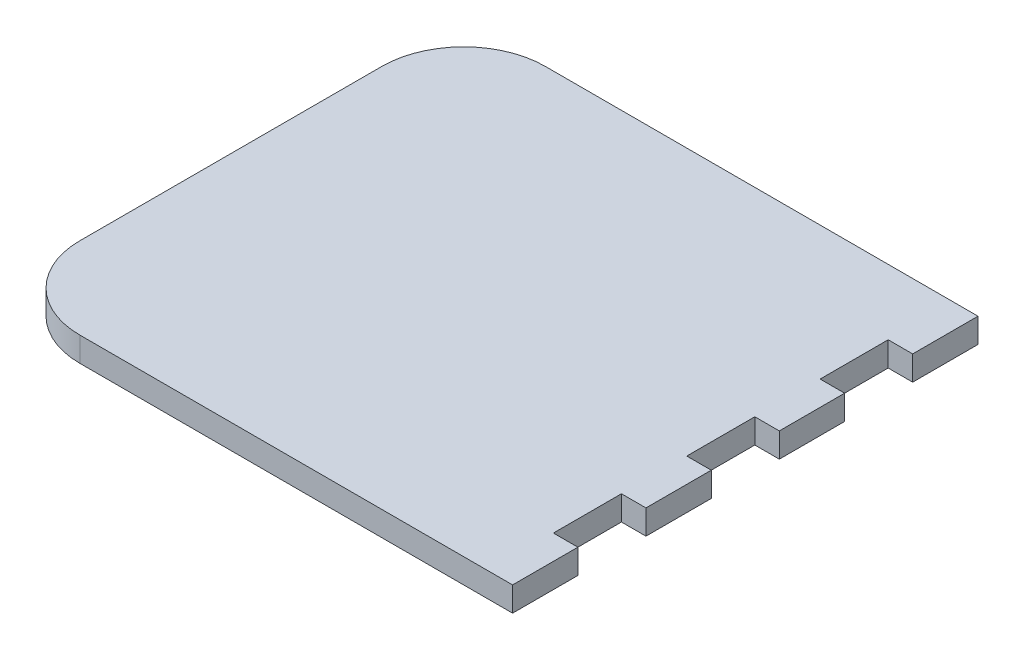
ISO-10303-21;
HEADER;
FILE_DESCRIPTION(('STEP AP214'),'2;1');
FILE_NAME('part.step','',(''),(''),'','','');
FILE_SCHEMA(('AUTOMOTIVE_DESIGN { 1 0 10303 214 1 1 1 1 }'));
ENDSEC;
DATA;
#1=APPLICATION_CONTEXT('core data for automotive mechanical design processes');
#2=APPLICATION_PROTOCOL_DEFINITION('international standard','automotive_design',2000,#1);
#3=PRODUCT_CONTEXT('',#1,'mechanical');
#4=PRODUCT('Part','Part','',(#3));
#5=PRODUCT_RELATED_PRODUCT_CATEGORY('part','',(#4));
#6=PRODUCT_DEFINITION_FORMATION('','',#4);
#7=PRODUCT_DEFINITION_CONTEXT('part definition',#1,'design');
#8=PRODUCT_DEFINITION('design','',#6,#7);
#9=PRODUCT_DEFINITION_SHAPE('','',#8);
#10=(LENGTH_UNIT() NAMED_UNIT(*) SI_UNIT(.MILLI.,.METRE.));
#11=(NAMED_UNIT(*) PLANE_ANGLE_UNIT() SI_UNIT($,.RADIAN.));
#12=(NAMED_UNIT(*) SI_UNIT($,.STERADIAN.) SOLID_ANGLE_UNIT());
#13=UNCERTAINTY_MEASURE_WITH_UNIT(LENGTH_MEASURE(1.E-05),#10,'distance_accuracy_value','');
#14=(GEOMETRIC_REPRESENTATION_CONTEXT(3) GLOBAL_UNCERTAINTY_ASSIGNED_CONTEXT((#13)) GLOBAL_UNIT_ASSIGNED_CONTEXT((#10,
#11,#12)) REPRESENTATION_CONTEXT('',''));
#15=CARTESIAN_POINT('',(0.,0.,0.));
#16=DIRECTION('',(0.,0.,1.));
#17=DIRECTION('',(1.,0.,0.));
#18=AXIS2_PLACEMENT_3D('',#15,#16,#17);
#19=CARTESIAN_POINT('',(0.,3.,0.));
#20=DIRECTION('',(-1.,0.,0.));
#21=DIRECTION('',(0.,0.,1.));
#22=AXIS2_PLACEMENT_3D('',#19,#20,#21);
#23=PLANE('',#22);
#24=DIRECTION('',(0.,1.,0.));
#25=VECTOR('',#24,1.);
#26=CARTESIAN_POINT('',(0.,0.,-40.6666666666667));
#27=LINE('',#26,#25);
#28=CARTESIAN_POINT('',(0.,0.,-40.6666666666667));
#29=VERTEX_POINT('',#28);
#30=CARTESIAN_POINT('',(0.,3.,-40.6666666666667));
#31=VERTEX_POINT('',#30);
#32=EDGE_CURVE('E169',#29,#31,#27,.T.);
#33=ORIENTED_EDGE('',*,*,#32,.T.);
#34=DIRECTION('',(0.,0.,-1.));
#35=VECTOR('',#34,1.);
#36=CARTESIAN_POINT('',(0.,3.,0.));
#37=LINE('',#36,#35);
#38=CARTESIAN_POINT('',(0.,3.,-32.6666666666667));
#39=VERTEX_POINT('',#38);
#40=EDGE_CURVE('E338',#39,#31,#37,.T.);
#41=ORIENTED_EDGE('',*,*,#40,.F.);
#42=DIRECTION('',(0.,1.,0.));
#43=VECTOR('',#42,1.);
#44=CARTESIAN_POINT('',(0.,0.,-32.6666666666667));
#45=LINE('',#44,#43);
#46=CARTESIAN_POINT('',(0.,0.,-32.6666666666667));
#47=VERTEX_POINT('',#46);
#48=EDGE_CURVE('E222',#47,#39,#45,.T.);
#49=ORIENTED_EDGE('',*,*,#48,.F.);
#50=DIRECTION('',(0.,0.,-1.));
#51=VECTOR('',#50,1.);
#52=CARTESIAN_POINT('',(0.,0.,0.));
#53=LINE('',#52,#51);
#54=EDGE_CURVE('E316',#47,#29,#53,.T.);
#55=ORIENTED_EDGE('',*,*,#54,.T.);
#56=EDGE_LOOP('',(#33,#41,#49,#55));
#57=FACE_BOUND('',#56,.T.);
#58=ADVANCED_FACE('F37',(#57),#23,.F.);
#59=DIRECTION('',(0.,1.,0.));
#60=VECTOR('',#59,1.);
#61=CARTESIAN_POINT('',(0.,0.,-24.3333333333333));
#62=LINE('',#61,#60);
#63=CARTESIAN_POINT('',(0.,0.,-24.3333333333333));
#64=VERTEX_POINT('',#63);
#65=CARTESIAN_POINT('',(0.,3.,-24.3333333333333));
#66=VERTEX_POINT('',#65);
#67=EDGE_CURVE('E224',#64,#66,#62,.T.);
#68=ORIENTED_EDGE('',*,*,#67,.T.);
#69=CARTESIAN_POINT('',(0.,3.,-16.3333333333333));
#70=VERTEX_POINT('',#69);
#71=EDGE_CURVE('E257',#70,#66,#37,.T.);
#72=ORIENTED_EDGE('',*,*,#71,.F.);
#73=DIRECTION('',(0.,1.,0.));
#74=VECTOR('',#73,1.);
#75=CARTESIAN_POINT('',(0.,0.,-16.3333333333333));
#76=LINE('',#75,#74);
#77=CARTESIAN_POINT('',(0.,0.,-16.3333333333333));
#78=VERTEX_POINT('',#77);
#79=EDGE_CURVE('E247',#78,#70,#76,.T.);
#80=ORIENTED_EDGE('',*,*,#79,.F.);
#81=EDGE_CURVE('E269',#78,#64,#53,.T.);
#82=ORIENTED_EDGE('',*,*,#81,.T.);
#83=EDGE_LOOP('',(#68,#72,#80,#82));
#84=FACE_BOUND('',#83,.T.);
#85=ADVANCED_FACE('F323',(#84),#23,.F.);
#86=DIRECTION('',(0.,1.,0.));
#87=VECTOR('',#86,1.);
#88=CARTESIAN_POINT('',(0.,0.,-8.));
#89=LINE('',#88,#87);
#90=CARTESIAN_POINT('',(0.,0.,-8.));
#91=VERTEX_POINT('',#90);
#92=CARTESIAN_POINT('',(0.,3.,-8.));
#93=VERTEX_POINT('',#92);
#94=EDGE_CURVE('E249',#91,#93,#89,.T.);
#95=ORIENTED_EDGE('',*,*,#94,.T.);
#96=CARTESIAN_POINT('',(0.,3.,0.));
#97=VERTEX_POINT('',#96);
#98=EDGE_CURVE('E253',#97,#93,#37,.T.);
#99=ORIENTED_EDGE('',*,*,#98,.F.);
#100=DIRECTION('',(0.,-1.,0.));
#101=VECTOR('',#100,1.);
#102=CARTESIAN_POINT('',(0.,3.,0.));
#103=LINE('',#102,#101);
#104=CARTESIAN_POINT('',(0.,0.,0.));
#105=VERTEX_POINT('',#104);
#106=EDGE_CURVE('E264',#97,#105,#103,.T.);
#107=ORIENTED_EDGE('',*,*,#106,.T.);
#108=EDGE_CURVE('E265',#105,#91,#53,.T.);
#109=ORIENTED_EDGE('',*,*,#108,.T.);
#110=EDGE_LOOP('',(#95,#99,#107,#109));
#111=FACE_BOUND('',#110,.T.);
#112=ADVANCED_FACE('F357',(#111),#23,.F.);
#113=CARTESIAN_POINT('',(0.,3.,-49.));
#114=VERTEX_POINT('',#113);
#115=CARTESIAN_POINT('',(0.,3.,-57.));
#116=VERTEX_POINT('',#115);
#117=EDGE_CURVE('E258',#114,#116,#37,.T.);
#118=ORIENTED_EDGE('',*,*,#117,.F.);
#119=DIRECTION('',(0.,1.,0.));
#120=VECTOR('',#119,1.);
#121=CARTESIAN_POINT('',(0.,0.,-49.));
#122=LINE('',#121,#120);
#123=CARTESIAN_POINT('',(0.,0.,-49.));
#124=VERTEX_POINT('',#123);
#125=EDGE_CURVE('E200',#124,#114,#122,.T.);
#126=ORIENTED_EDGE('',*,*,#125,.F.);
#127=CARTESIAN_POINT('',(0.,0.,-57.));
#128=VERTEX_POINT('',#127);
#129=EDGE_CURVE('E246',#124,#128,#53,.T.);
#130=ORIENTED_EDGE('',*,*,#129,.T.);
#131=DIRECTION('',(0.,-1.,0.));
#132=VECTOR('',#131,1.);
#133=CARTESIAN_POINT('',(0.,3.,-57.));
#134=LINE('',#133,#132);
#135=EDGE_CURVE('E277',#116,#128,#134,.T.);
#136=ORIENTED_EDGE('',*,*,#135,.F.);
#137=EDGE_LOOP('',(#118,#126,#130,#136));
#138=FACE_BOUND('',#137,.T.);
#139=ADVANCED_FACE('F314',(#138),#23,.F.);
#140=CARTESIAN_POINT('',(0.,3.,-57.));
#141=DIRECTION('',(0.,0.,1.));
#142=DIRECTION('',(1.,0.,0.));
#143=AXIS2_PLACEMENT_3D('',#140,#141,#142);
#144=PLANE('',#143);
#145=DIRECTION('',(-1.,0.,0.));
#146=VECTOR('',#145,1.);
#147=CARTESIAN_POINT('',(0.,0.,-57.));
#148=LINE('',#147,#146);
#149=CARTESIAN_POINT('',(-53.,0.,-57.));
#150=VERTEX_POINT('',#149);
#151=EDGE_CURVE('E268',#128,#150,#148,.T.);
#152=ORIENTED_EDGE('',*,*,#151,.T.);
#153=DIRECTION('',(0.,-1.,0.));
#154=VECTOR('',#153,1.);
#155=CARTESIAN_POINT('',(-53.,3.,-57.));
#156=LINE('',#155,#154);
#157=CARTESIAN_POINT('',(-53.,3.,-57.));
#158=VERTEX_POINT('',#157);
#159=EDGE_CURVE('E11',#150,#158,#156,.F.);
#160=ORIENTED_EDGE('',*,*,#159,.T.);
#161=DIRECTION('',(-1.,0.,0.));
#162=VECTOR('',#161,1.);
#163=CARTESIAN_POINT('',(0.,3.,-57.));
#164=LINE('',#163,#162);
#165=EDGE_CURVE('E256',#116,#158,#164,.T.);
#166=ORIENTED_EDGE('',*,*,#165,.F.);
#167=ORIENTED_EDGE('',*,*,#135,.T.);
#168=EDGE_LOOP('',(#152,#160,#166,#167));
#169=FACE_BOUND('',#168,.T.);
#170=ADVANCED_FACE('F310',(#169),#144,.F.);
#171=CARTESIAN_POINT('',(-63.,3.,0.));
#172=DIRECTION('',(1.,0.,0.));
#173=DIRECTION('',(0.,0.,-1.));
#174=AXIS2_PLACEMENT_3D('',#171,#172,#173);
#175=PLANE('',#174);
#176=DIRECTION('',(0.,0.,1.));
#177=VECTOR('',#176,1.);
#178=CARTESIAN_POINT('',(-63.,0.,0.));
#179=LINE('',#178,#177);
#180=CARTESIAN_POINT('',(-63.,0.,-47.));
#181=VERTEX_POINT('',#180);
#182=CARTESIAN_POINT('',(-63.,0.,-9.99999999999999));
#183=VERTEX_POINT('',#182);
#184=EDGE_CURVE('E271',#181,#183,#179,.T.);
#185=ORIENTED_EDGE('',*,*,#184,.T.);
#186=DIRECTION('',(0.,-1.,0.));
#187=VECTOR('',#186,1.);
#188=CARTESIAN_POINT('',(-63.,3.,-9.99999999999999));
#189=LINE('',#188,#187);
#190=CARTESIAN_POINT('',(-63.,3.,-9.99999999999999));
#191=VERTEX_POINT('',#190);
#192=EDGE_CURVE('E58',#183,#191,#189,.F.);
#193=ORIENTED_EDGE('',*,*,#192,.T.);
#194=DIRECTION('',(0.,0.,1.));
#195=VECTOR('',#194,1.);
#196=CARTESIAN_POINT('',(-63.,3.,0.));
#197=LINE('',#196,#195);
#198=CARTESIAN_POINT('',(-63.,3.,-47.));
#199=VERTEX_POINT('',#198);
#200=EDGE_CURVE('E260',#199,#191,#197,.T.);
#201=ORIENTED_EDGE('',*,*,#200,.F.);
#202=DIRECTION('',(0.,-1.,0.));
#203=VECTOR('',#202,1.);
#204=CARTESIAN_POINT('',(-63.,3.,-47.));
#205=LINE('',#204,#203);
#206=EDGE_CURVE('E287',#199,#181,#205,.T.);
#207=ORIENTED_EDGE('',*,*,#206,.T.);
#208=EDGE_LOOP('',(#185,#193,#201,#207));
#209=FACE_BOUND('',#208,.T.);
#210=ADVANCED_FACE('F305',(#209),#175,.F.);
#211=CARTESIAN_POINT('',(0.,3.,0.));
#212=DIRECTION('',(0.,0.,-1.));
#213=DIRECTION('',(-1.,0.,0.));
#214=AXIS2_PLACEMENT_3D('',#211,#212,#213);
#215=PLANE('',#214);
#216=DIRECTION('',(1.,0.,0.));
#217=VECTOR('',#216,1.);
#218=CARTESIAN_POINT('',(0.,3.,0.));
#219=LINE('',#218,#217);
#220=CARTESIAN_POINT('',(-53.,3.,0.));
#221=VERTEX_POINT('',#220);
#222=EDGE_CURVE('E262',#221,#97,#219,.T.);
#223=ORIENTED_EDGE('',*,*,#222,.F.);
#224=DIRECTION('',(0.,-1.,0.));
#225=VECTOR('',#224,1.);
#226=CARTESIAN_POINT('',(-53.,3.,0.));
#227=LINE('',#226,#225);
#228=CARTESIAN_POINT('',(-53.,0.,0.));
#229=VERTEX_POINT('',#228);
#230=EDGE_CURVE('E280',#221,#229,#227,.T.);
#231=ORIENTED_EDGE('',*,*,#230,.T.);
#232=DIRECTION('',(1.,0.,0.));
#233=VECTOR('',#232,1.);
#234=CARTESIAN_POINT('',(0.,0.,0.));
#235=LINE('',#234,#233);
#236=EDGE_CURVE('E273',#229,#105,#235,.T.);
#237=ORIENTED_EDGE('',*,*,#236,.T.);
#238=ORIENTED_EDGE('',*,*,#106,.F.);
#239=EDGE_LOOP('',(#223,#231,#237,#238));
#240=FACE_BOUND('',#239,.T.);
#241=ADVANCED_FACE('F300',(#240),#215,.F.);
#242=CARTESIAN_POINT('',(0.,3.,0.));
#243=DIRECTION('',(0.,1.,0.));
#244=DIRECTION('',(0.,0.,1.));
#245=AXIS2_PLACEMENT_3D('',#242,#243,#244);
#246=PLANE('',#245);
#247=ORIENTED_EDGE('',*,*,#200,.T.);
#248=CARTESIAN_POINT('',(-53.,3.,-9.99999999999999));
#249=DIRECTION('',(0.,1.,0.));
#250=DIRECTION('',(0.,0.,1.));
#251=AXIS2_PLACEMENT_3D('',#248,#249,#250);
#252=CIRCLE('',#251,10.);
#253=EDGE_CURVE('E45',#191,#221,#252,.T.);
#254=ORIENTED_EDGE('',*,*,#253,.T.);
#255=ORIENTED_EDGE('',*,*,#222,.T.);
#256=ORIENTED_EDGE('',*,*,#98,.T.);
#257=DIRECTION('',(-1.,0.,0.));
#258=VECTOR('',#257,1.);
#259=CARTESIAN_POINT('',(0.,3.,-8.));
#260=LINE('',#259,#258);
#261=CARTESIAN_POINT('',(-3.,3.,-8.));
#262=VERTEX_POINT('',#261);
#263=EDGE_CURVE('E239',#93,#262,#260,.T.);
#264=ORIENTED_EDGE('',*,*,#263,.T.);
#265=DIRECTION('',(0.,0.,-1.));
#266=VECTOR('',#265,1.);
#267=CARTESIAN_POINT('',(-3.,3.,0.));
#268=LINE('',#267,#266);
#269=CARTESIAN_POINT('',(-3.,3.,-16.3333333333333));
#270=VERTEX_POINT('',#269);
#271=EDGE_CURVE('E221',#262,#270,#268,.T.);
#272=ORIENTED_EDGE('',*,*,#271,.T.);
#273=DIRECTION('',(-1.,0.,0.));
#274=VECTOR('',#273,1.);
#275=CARTESIAN_POINT('',(0.,3.,-16.3333333333333));
#276=LINE('',#275,#274);
#277=EDGE_CURVE('E231',#70,#270,#276,.T.);
#278=ORIENTED_EDGE('',*,*,#277,.F.);
#279=ORIENTED_EDGE('',*,*,#71,.T.);
#280=DIRECTION('',(-1.,0.,0.));
#281=VECTOR('',#280,1.);
#282=CARTESIAN_POINT('',(0.,3.,-24.3333333333333));
#283=LINE('',#282,#281);
#284=CARTESIAN_POINT('',(-3.,3.,-24.3333333333333));
#285=VERTEX_POINT('',#284);
#286=EDGE_CURVE('E214',#66,#285,#283,.T.);
#287=ORIENTED_EDGE('',*,*,#286,.T.);
#288=DIRECTION('',(0.,0.,-1.));
#289=VECTOR('',#288,1.);
#290=CARTESIAN_POINT('',(-3.,3.,0.));
#291=LINE('',#290,#289);
#292=CARTESIAN_POINT('',(-3.,3.,-32.6666666666667));
#293=VERTEX_POINT('',#292);
#294=EDGE_CURVE('E199',#285,#293,#291,.T.);
#295=ORIENTED_EDGE('',*,*,#294,.T.);
#296=DIRECTION('',(-1.,0.,0.));
#297=VECTOR('',#296,1.);
#298=CARTESIAN_POINT('',(0.,3.,-32.6666666666667));
#299=LINE('',#298,#297);
#300=EDGE_CURVE('E206',#39,#293,#299,.T.);
#301=ORIENTED_EDGE('',*,*,#300,.F.);
#302=ORIENTED_EDGE('',*,*,#40,.T.);
#303=DIRECTION('',(-1.,0.,0.));
#304=VECTOR('',#303,1.);
#305=CARTESIAN_POINT('',(0.,3.,-40.6666666666667));
#306=LINE('',#305,#304);
#307=CARTESIAN_POINT('',(-3.,3.,-40.6666666666667));
#308=VERTEX_POINT('',#307);
#309=EDGE_CURVE('E191',#31,#308,#306,.T.);
#310=ORIENTED_EDGE('',*,*,#309,.T.);
#311=DIRECTION('',(0.,0.,-1.));
#312=VECTOR('',#311,1.);
#313=CARTESIAN_POINT('',(-3.,3.,0.));
#314=LINE('',#313,#312);
#315=CARTESIAN_POINT('',(-3.,3.,-49.));
#316=VERTEX_POINT('',#315);
#317=EDGE_CURVE('E181',#308,#316,#314,.T.);
#318=ORIENTED_EDGE('',*,*,#317,.T.);
#319=DIRECTION('',(-1.,0.,0.));
#320=VECTOR('',#319,1.);
#321=CARTESIAN_POINT('',(0.,3.,-49.));
#322=LINE('',#321,#320);
#323=EDGE_CURVE('E188',#114,#316,#322,.T.);
#324=ORIENTED_EDGE('',*,*,#323,.F.);
#325=ORIENTED_EDGE('',*,*,#117,.T.);
#326=ORIENTED_EDGE('',*,*,#165,.T.);
#327=CARTESIAN_POINT('',(-53.,3.,-47.));
#328=DIRECTION('',(0.,1.,0.));
#329=DIRECTION('',(0.,0.,1.));
#330=AXIS2_PLACEMENT_3D('',#327,#328,#329);
#331=CIRCLE('',#330,10.);
#332=EDGE_CURVE('E291',#158,#199,#331,.T.);
#333=ORIENTED_EDGE('',*,*,#332,.T.);
#334=EDGE_LOOP('',(#247,#254,#255,#256,#264,#272,#278,#279,#287,#295,#301,#302,#310,#318,#324,
#325,#326,#333));
#335=FACE_BOUND('',#334,.T.);
#336=ADVANCED_FACE('F295',(#335),#246,.T.);
#337=CARTESIAN_POINT('',(0.,0.,0.));
#338=DIRECTION('',(0.,1.,0.));
#339=DIRECTION('',(0.,0.,1.));
#340=AXIS2_PLACEMENT_3D('',#337,#338,#339);
#341=PLANE('',#340);
#342=ORIENTED_EDGE('',*,*,#236,.F.);
#343=CARTESIAN_POINT('',(-53.,0.,-9.99999999999999));
#344=DIRECTION('',(0.,1.,0.));
#345=DIRECTION('',(0.,0.,1.));
#346=AXIS2_PLACEMENT_3D('',#343,#344,#345);
#347=CIRCLE('',#346,10.);
#348=EDGE_CURVE('E285',#229,#183,#347,.F.);
#349=ORIENTED_EDGE('',*,*,#348,.T.);
#350=ORIENTED_EDGE('',*,*,#184,.F.);
#351=CARTESIAN_POINT('',(-53.,0.,-47.));
#352=DIRECTION('',(0.,1.,0.));
#353=DIRECTION('',(0.,0.,1.));
#354=AXIS2_PLACEMENT_3D('',#351,#352,#353);
#355=CIRCLE('',#354,10.);
#356=EDGE_CURVE('E283',#181,#150,#355,.F.);
#357=ORIENTED_EDGE('',*,*,#356,.T.);
#358=ORIENTED_EDGE('',*,*,#151,.F.);
#359=ORIENTED_EDGE('',*,*,#129,.F.);
#360=DIRECTION('',(-1.,0.,0.));
#361=VECTOR('',#360,1.);
#362=CARTESIAN_POINT('',(0.,0.,-49.));
#363=LINE('',#362,#361);
#364=CARTESIAN_POINT('',(-3.,0.,-49.));
#365=VERTEX_POINT('',#364);
#366=EDGE_CURVE('E174',#124,#365,#363,.T.);
#367=ORIENTED_EDGE('',*,*,#366,.T.);
#368=DIRECTION('',(0.,0.,-1.));
#369=VECTOR('',#368,1.);
#370=CARTESIAN_POINT('',(-3.,0.,0.));
#371=LINE('',#370,#369);
#372=CARTESIAN_POINT('',(-3.,0.,-40.6666666666667));
#373=VERTEX_POINT('',#372);
#374=EDGE_CURVE('E175',#373,#365,#371,.T.);
#375=ORIENTED_EDGE('',*,*,#374,.F.);
#376=DIRECTION('',(-1.,0.,0.));
#377=VECTOR('',#376,1.);
#378=CARTESIAN_POINT('',(0.,0.,-40.6666666666667));
#379=LINE('',#378,#377);
#380=EDGE_CURVE('E163',#29,#373,#379,.T.);
#381=ORIENTED_EDGE('',*,*,#380,.F.);
#382=ORIENTED_EDGE('',*,*,#54,.F.);
#383=DIRECTION('',(-1.,0.,0.));
#384=VECTOR('',#383,1.);
#385=CARTESIAN_POINT('',(0.,0.,-32.6666666666667));
#386=LINE('',#385,#384);
#387=CARTESIAN_POINT('',(-3.,0.,-32.6666666666667));
#388=VERTEX_POINT('',#387);
#389=EDGE_CURVE('E208',#47,#388,#386,.T.);
#390=ORIENTED_EDGE('',*,*,#389,.T.);
#391=DIRECTION('',(0.,0.,-1.));
#392=VECTOR('',#391,1.);
#393=CARTESIAN_POINT('',(-3.,0.,0.));
#394=LINE('',#393,#392);
#395=CARTESIAN_POINT('',(-3.,0.,-24.3333333333333));
#396=VERTEX_POINT('',#395);
#397=EDGE_CURVE('E203',#396,#388,#394,.T.);
#398=ORIENTED_EDGE('',*,*,#397,.F.);
#399=DIRECTION('',(-1.,0.,0.));
#400=VECTOR('',#399,1.);
#401=CARTESIAN_POINT('',(0.,0.,-24.3333333333333));
#402=LINE('',#401,#400);
#403=EDGE_CURVE('E205',#64,#396,#402,.T.);
#404=ORIENTED_EDGE('',*,*,#403,.F.);
#405=ORIENTED_EDGE('',*,*,#81,.F.);
#406=DIRECTION('',(-1.,0.,0.));
#407=VECTOR('',#406,1.);
#408=CARTESIAN_POINT('',(0.,0.,-16.3333333333333));
#409=LINE('',#408,#407);
#410=CARTESIAN_POINT('',(-3.,0.,-16.3333333333333));
#411=VERTEX_POINT('',#410);
#412=EDGE_CURVE('E233',#78,#411,#409,.T.);
#413=ORIENTED_EDGE('',*,*,#412,.T.);
#414=DIRECTION('',(0.,0.,-1.));
#415=VECTOR('',#414,1.);
#416=CARTESIAN_POINT('',(-3.,0.,0.));
#417=LINE('',#416,#415);
#418=CARTESIAN_POINT('',(-3.,0.,-8.));
#419=VERTEX_POINT('',#418);
#420=EDGE_CURVE('E228',#419,#411,#417,.T.);
#421=ORIENTED_EDGE('',*,*,#420,.F.);
#422=DIRECTION('',(-1.,0.,0.));
#423=VECTOR('',#422,1.);
#424=CARTESIAN_POINT('',(0.,0.,-8.));
#425=LINE('',#424,#423);
#426=EDGE_CURVE('E230',#91,#419,#425,.T.);
#427=ORIENTED_EDGE('',*,*,#426,.F.);
#428=ORIENTED_EDGE('',*,*,#108,.F.);
#429=EDGE_LOOP('',(#342,#349,#350,#357,#358,#359,#367,#375,#381,#382,#390,#398,#404,#405,#413,
#421,#427,#428));
#430=FACE_BOUND('',#429,.T.);
#431=ADVANCED_FACE('F186',(#430),#341,.F.);
#432=CARTESIAN_POINT('',(-3.,0.,0.));
#433=DIRECTION('',(1.,0.,0.));
#434=DIRECTION('',(0.,0.,-1.));
#435=AXIS2_PLACEMENT_3D('',#432,#433,#434);
#436=PLANE('',#435);
#437=ORIENTED_EDGE('',*,*,#271,.F.);
#438=DIRECTION('',(0.,1.,0.));
#439=VECTOR('',#438,1.);
#440=CARTESIAN_POINT('',(-3.,0.,-8.));
#441=LINE('',#440,#439);
#442=EDGE_CURVE('E236',#419,#262,#441,.T.);
#443=ORIENTED_EDGE('',*,*,#442,.F.);
#444=ORIENTED_EDGE('',*,*,#420,.T.);
#445=DIRECTION('',(0.,1.,0.));
#446=VECTOR('',#445,1.);
#447=CARTESIAN_POINT('',(-3.,0.,-16.3333333333333));
#448=LINE('',#447,#446);
#449=EDGE_CURVE('E244',#411,#270,#448,.T.);
#450=ORIENTED_EDGE('',*,*,#449,.T.);
#451=EDGE_LOOP('',(#437,#443,#444,#450));
#452=FACE_BOUND('',#451,.T.);
#453=ADVANCED_FACE('F373',(#452),#436,.T.);
#454=CARTESIAN_POINT('',(0.,0.,-16.3333333333333));
#455=DIRECTION('',(0.,0.,-1.));
#456=DIRECTION('',(-1.,0.,0.));
#457=AXIS2_PLACEMENT_3D('',#454,#455,#456);
#458=PLANE('',#457);
#459=ORIENTED_EDGE('',*,*,#277,.T.);
#460=ORIENTED_EDGE('',*,*,#449,.F.);
#461=ORIENTED_EDGE('',*,*,#412,.F.);
#462=ORIENTED_EDGE('',*,*,#79,.T.);
#463=EDGE_LOOP('',(#459,#460,#461,#462));
#464=FACE_BOUND('',#463,.T.);
#465=ADVANCED_FACE('F376',(#464),#458,.F.);
#466=CARTESIAN_POINT('',(0.,0.,-8.));
#467=DIRECTION('',(0.,0.,-1.));
#468=DIRECTION('',(-1.,0.,0.));
#469=AXIS2_PLACEMENT_3D('',#466,#467,#468);
#470=PLANE('',#469);
#471=ORIENTED_EDGE('',*,*,#263,.F.);
#472=ORIENTED_EDGE('',*,*,#94,.F.);
#473=ORIENTED_EDGE('',*,*,#426,.T.);
#474=ORIENTED_EDGE('',*,*,#442,.T.);
#475=EDGE_LOOP('',(#471,#472,#473,#474));
#476=FACE_BOUND('',#475,.T.);
#477=ADVANCED_FACE('F370',(#476),#470,.T.);
#478=CARTESIAN_POINT('',(-3.,0.,0.));
#479=DIRECTION('',(1.,0.,0.));
#480=DIRECTION('',(0.,0.,-1.));
#481=AXIS2_PLACEMENT_3D('',#478,#479,#480);
#482=PLANE('',#481);
#483=ORIENTED_EDGE('',*,*,#294,.F.);
#484=DIRECTION('',(0.,1.,0.));
#485=VECTOR('',#484,1.);
#486=CARTESIAN_POINT('',(-3.,0.,-24.3333333333333));
#487=LINE('',#486,#485);
#488=EDGE_CURVE('E211',#396,#285,#487,.T.);
#489=ORIENTED_EDGE('',*,*,#488,.F.);
#490=ORIENTED_EDGE('',*,*,#397,.T.);
#491=DIRECTION('',(0.,1.,0.));
#492=VECTOR('',#491,1.);
#493=CARTESIAN_POINT('',(-3.,0.,-32.6666666666667));
#494=LINE('',#493,#492);
#495=EDGE_CURVE('E219',#388,#293,#494,.T.);
#496=ORIENTED_EDGE('',*,*,#495,.T.);
#497=EDGE_LOOP('',(#483,#489,#490,#496));
#498=FACE_BOUND('',#497,.T.);
#499=ADVANCED_FACE('F334',(#498),#482,.T.);
#500=CARTESIAN_POINT('',(0.,0.,-32.6666666666667));
#501=DIRECTION('',(0.,0.,-1.));
#502=DIRECTION('',(-1.,0.,0.));
#503=AXIS2_PLACEMENT_3D('',#500,#501,#502);
#504=PLANE('',#503);
#505=ORIENTED_EDGE('',*,*,#300,.T.);
#506=ORIENTED_EDGE('',*,*,#495,.F.);
#507=ORIENTED_EDGE('',*,*,#389,.F.);
#508=ORIENTED_EDGE('',*,*,#48,.T.);
#509=EDGE_LOOP('',(#505,#506,#507,#508));
#510=FACE_BOUND('',#509,.T.);
#511=ADVANCED_FACE('F438',(#510),#504,.F.);
#512=CARTESIAN_POINT('',(0.,0.,-24.3333333333333));
#513=DIRECTION('',(0.,0.,-1.));
#514=DIRECTION('',(-1.,0.,0.));
#515=AXIS2_PLACEMENT_3D('',#512,#513,#514);
#516=PLANE('',#515);
#517=ORIENTED_EDGE('',*,*,#286,.F.);
#518=ORIENTED_EDGE('',*,*,#67,.F.);
#519=ORIENTED_EDGE('',*,*,#403,.T.);
#520=ORIENTED_EDGE('',*,*,#488,.T.);
#521=EDGE_LOOP('',(#517,#518,#519,#520));
#522=FACE_BOUND('',#521,.T.);
#523=ADVANCED_FACE('F331',(#522),#516,.T.);
#524=CARTESIAN_POINT('',(-3.,0.,0.));
#525=DIRECTION('',(1.,0.,0.));
#526=DIRECTION('',(0.,0.,-1.));
#527=AXIS2_PLACEMENT_3D('',#524,#525,#526);
#528=PLANE('',#527);
#529=ORIENTED_EDGE('',*,*,#317,.F.);
#530=DIRECTION('',(0.,1.,0.));
#531=VECTOR('',#530,1.);
#532=CARTESIAN_POINT('',(-3.,0.,-40.6666666666667));
#533=LINE('',#532,#531);
#534=EDGE_CURVE('E166',#373,#308,#533,.T.);
#535=ORIENTED_EDGE('',*,*,#534,.F.);
#536=ORIENTED_EDGE('',*,*,#374,.T.);
#537=DIRECTION('',(0.,1.,0.));
#538=VECTOR('',#537,1.);
#539=CARTESIAN_POINT('',(-3.,0.,-49.));
#540=LINE('',#539,#538);
#541=EDGE_CURVE('E197',#365,#316,#540,.T.);
#542=ORIENTED_EDGE('',*,*,#541,.T.);
#543=EDGE_LOOP('',(#529,#535,#536,#542));
#544=FACE_BOUND('',#543,.T.);
#545=ADVANCED_FACE('F178',(#544),#528,.T.);
#546=CARTESIAN_POINT('',(0.,0.,-49.));
#547=DIRECTION('',(0.,0.,-1.));
#548=DIRECTION('',(-1.,0.,0.));
#549=AXIS2_PLACEMENT_3D('',#546,#547,#548);
#550=PLANE('',#549);
#551=ORIENTED_EDGE('',*,*,#323,.T.);
#552=ORIENTED_EDGE('',*,*,#541,.F.);
#553=ORIENTED_EDGE('',*,*,#366,.F.);
#554=ORIENTED_EDGE('',*,*,#125,.T.);
#555=EDGE_LOOP('',(#551,#552,#553,#554));
#556=FACE_BOUND('',#555,.T.);
#557=ADVANCED_FACE('F343',(#556),#550,.F.);
#558=CARTESIAN_POINT('',(0.,0.,-40.6666666666667));
#559=DIRECTION('',(0.,0.,-1.));
#560=DIRECTION('',(-1.,0.,0.));
#561=AXIS2_PLACEMENT_3D('',#558,#559,#560);
#562=PLANE('',#561);
#563=ORIENTED_EDGE('',*,*,#309,.F.);
#564=ORIENTED_EDGE('',*,*,#32,.F.);
#565=ORIENTED_EDGE('',*,*,#380,.T.);
#566=ORIENTED_EDGE('',*,*,#534,.T.);
#567=EDGE_LOOP('',(#563,#564,#565,#566));
#568=FACE_BOUND('',#567,.T.);
#569=ADVANCED_FACE('F165',(#568),#562,.T.);
#570=CARTESIAN_POINT('',(-53.,3.,-9.99999999999999));
#571=DIRECTION('',(0.,-1.,0.));
#572=DIRECTION('',(0.,0.,-1.));
#573=AXIS2_PLACEMENT_3D('',#570,#571,#572);
#574=CYLINDRICAL_SURFACE('',#573,10.);
#575=ORIENTED_EDGE('',*,*,#253,.F.);
#576=ORIENTED_EDGE('',*,*,#192,.F.);
#577=ORIENTED_EDGE('',*,*,#348,.F.);
#578=ORIENTED_EDGE('',*,*,#230,.F.);
#579=EDGE_LOOP('',(#575,#576,#577,#578));
#580=FACE_BOUND('',#579,.T.);
#581=ADVANCED_FACE('F302',(#580),#574,.T.);
#582=CARTESIAN_POINT('',(-53.,3.,-47.));
#583=DIRECTION('',(0.,-1.,0.));
#584=DIRECTION('',(0.,0.,-1.));
#585=AXIS2_PLACEMENT_3D('',#582,#583,#584);
#586=CYLINDRICAL_SURFACE('',#585,10.);
#587=ORIENTED_EDGE('',*,*,#332,.F.);
#588=ORIENTED_EDGE('',*,*,#159,.F.);
#589=ORIENTED_EDGE('',*,*,#356,.F.);
#590=ORIENTED_EDGE('',*,*,#206,.F.);
#591=EDGE_LOOP('',(#587,#588,#589,#590));
#592=FACE_BOUND('',#591,.T.);
#593=ADVANCED_FACE('F39',(#592),#586,.T.);
#594=CLOSED_SHELL('',(#58,#85,#112,#139,#170,#210,#241,#336,#431,#453,#465,#477,#499,#511,#523,
#545,#557,#569,#581,#593));
#595=MANIFOLD_SOLID_BREP('B2',#594);
#596=ADVANCED_BREP_SHAPE_REPRESENTATION('',(#18,#595),#14);
#597=SHAPE_DEFINITION_REPRESENTATION(#9,#596);
ENDSEC;
END-ISO-10303-21;
